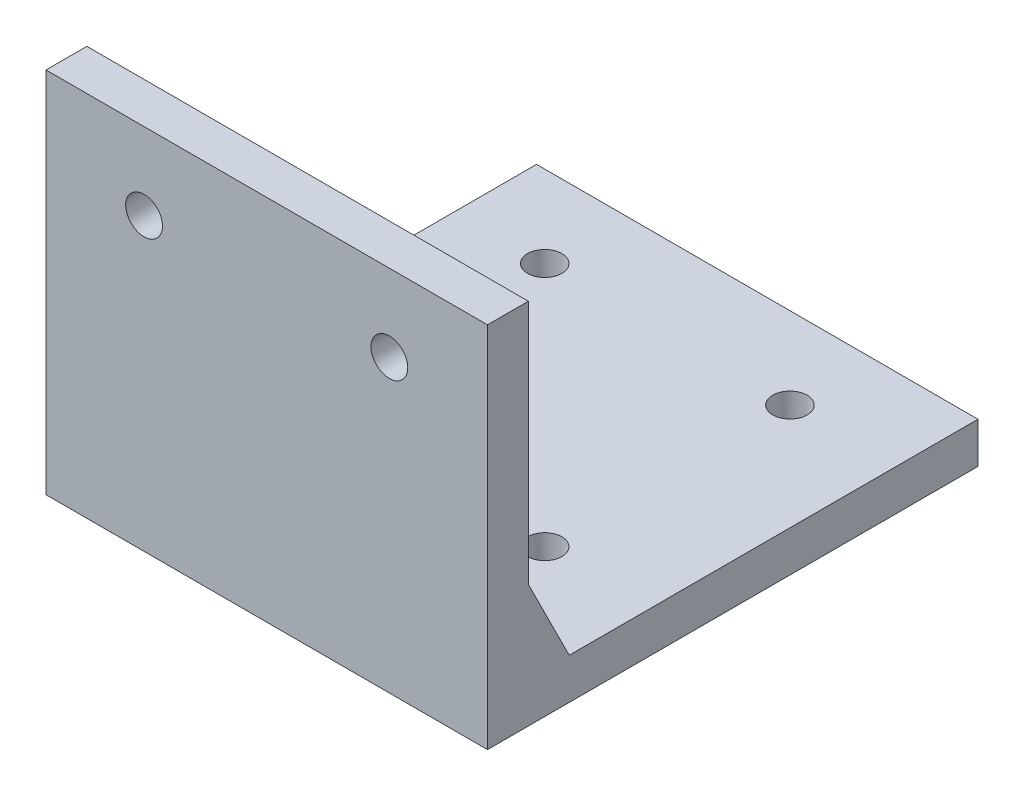
ISO-10303-21;
HEADER;
FILE_DESCRIPTION(('STEP AP214'),'2;1');
FILE_NAME('part.step','',(''),(''),'','','');
FILE_SCHEMA(('AUTOMOTIVE_DESIGN { 1 0 10303 214 1 1 1 1 }'));
ENDSEC;
DATA;
#1=APPLICATION_CONTEXT('core data for automotive mechanical design processes');
#2=APPLICATION_PROTOCOL_DEFINITION('international standard','automotive_design',2000,#1);
#3=PRODUCT_CONTEXT('',#1,'mechanical');
#4=PRODUCT('Part','Part','',(#3));
#5=PRODUCT_RELATED_PRODUCT_CATEGORY('part','',(#4));
#6=PRODUCT_DEFINITION_FORMATION('','',#4);
#7=PRODUCT_DEFINITION_CONTEXT('part definition',#1,'design');
#8=PRODUCT_DEFINITION('design','',#6,#7);
#9=PRODUCT_DEFINITION_SHAPE('','',#8);
#10=(LENGTH_UNIT() NAMED_UNIT(*) SI_UNIT(.MILLI.,.METRE.));
#11=(NAMED_UNIT(*) PLANE_ANGLE_UNIT() SI_UNIT($,.RADIAN.));
#12=(NAMED_UNIT(*) SI_UNIT($,.STERADIAN.) SOLID_ANGLE_UNIT());
#13=UNCERTAINTY_MEASURE_WITH_UNIT(LENGTH_MEASURE(1.E-05),#10,'distance_accuracy_value','');
#14=(GEOMETRIC_REPRESENTATION_CONTEXT(3) GLOBAL_UNCERTAINTY_ASSIGNED_CONTEXT((#13)) GLOBAL_UNIT_ASSIGNED_CONTEXT((#10,
#11,#12)) REPRESENTATION_CONTEXT('',''));
#15=CARTESIAN_POINT('',(0.,0.,0.));
#16=DIRECTION('',(0.,0.,1.));
#17=DIRECTION('',(1.,0.,0.));
#18=AXIS2_PLACEMENT_3D('',#15,#16,#17);
#19=CARTESIAN_POINT('',(54.,-17.9206342242443,1.15557027180788));
#20=DIRECTION('',(0.,0.,1.));
#21=DIRECTION('',(1.,0.,0.));
#22=AXIS2_PLACEMENT_3D('',#19,#20,#21);
#23=PLANE('',#22);
#24=CARTESIAN_POINT('',(42.,17.6532462868641,1.15557027180788));
#25=DIRECTION('',(0.,0.,1.));
#26=DIRECTION('',(1.,0.,0.));
#27=AXIS2_PLACEMENT_3D('',#24,#25,#26);
#28=CIRCLE('',#27,2.25);
#29=CARTESIAN_POINT('',(44.25,17.6532462868641,1.15557027180788));
#30=VERTEX_POINT('',#29);
#31=EDGE_CURVE('E146',#30,#30,#28,.T.);
#32=ORIENTED_EDGE('',*,*,#31,.F.);
#33=EDGE_LOOP('',(#32));
#34=FACE_BOUND('',#33,.T.);
#35=CARTESIAN_POINT('',(12.,17.6532462868641,1.15557027180788));
#36=DIRECTION('',(0.,0.,1.));
#37=DIRECTION('',(1.,0.,0.));
#38=AXIS2_PLACEMENT_3D('',#35,#36,#37);
#39=CIRCLE('',#38,2.25);
#40=CARTESIAN_POINT('',(14.25,17.6532462868641,1.15557027180788));
#41=VERTEX_POINT('',#40);
#42=EDGE_CURVE('E141',#41,#41,#39,.T.);
#43=ORIENTED_EDGE('',*,*,#42,.F.);
#44=EDGE_LOOP('',(#43));
#45=FACE_BOUND('',#44,.T.);
#46=DIRECTION('',(0.,1.,0.));
#47=VECTOR('',#46,1.);
#48=CARTESIAN_POINT('',(0.,-17.9206342242443,1.15557027180788));
#49=LINE('',#48,#47);
#50=CARTESIAN_POINT('',(0.,-17.9206342242443,1.15557027180788));
#51=VERTEX_POINT('',#50);
#52=CARTESIAN_POINT('',(0.,27.0793657757557,1.15557027180788));
#53=VERTEX_POINT('',#52);
#54=EDGE_CURVE('E122',#51,#53,#49,.T.);
#55=ORIENTED_EDGE('',*,*,#54,.F.);
#56=DIRECTION('',(-1.,0.,0.));
#57=VECTOR('',#56,1.);
#58=CARTESIAN_POINT('',(54.,-17.9206342242443,1.15557027180788));
#59=LINE('',#58,#57);
#60=CARTESIAN_POINT('',(54.,-17.9206342242443,1.15557027180788));
#61=VERTEX_POINT('',#60);
#62=EDGE_CURVE('E11',#61,#51,#59,.T.);
#63=ORIENTED_EDGE('',*,*,#62,.F.);
#64=DIRECTION('',(0.,1.,0.));
#65=VECTOR('',#64,1.);
#66=CARTESIAN_POINT('',(54.,-17.9206342242443,1.15557027180788));
#67=LINE('',#66,#65);
#68=CARTESIAN_POINT('',(54.,27.0793657757557,1.15557027180788));
#69=VERTEX_POINT('',#68);
#70=EDGE_CURVE('E131',#61,#69,#67,.T.);
#71=ORIENTED_EDGE('',*,*,#70,.T.);
#72=DIRECTION('',(-1.,0.,0.));
#73=VECTOR('',#72,1.);
#74=CARTESIAN_POINT('',(54.,27.0793657757557,1.15557027180788));
#75=LINE('',#74,#73);
#76=EDGE_CURVE('E135',#69,#53,#75,.T.);
#77=ORIENTED_EDGE('',*,*,#76,.T.);
#78=EDGE_LOOP('',(#55,#63,#71,#77));
#79=FACE_BOUND('',#78,.T.);
#80=ADVANCED_FACE('F40',(#34,#45,#79),#23,.T.);
#81=CARTESIAN_POINT('',(54.,-17.9206342242443,1.15557027180788));
#82=DIRECTION('',(0.,1.,0.));
#83=DIRECTION('',(0.,0.,1.));
#84=AXIS2_PLACEMENT_3D('',#81,#82,#83);
#85=PLANE('',#84);
#86=CARTESIAN_POINT('',(41.,-17.9206342242443,-48.8444297281921));
#87=DIRECTION('',(0.,1.,0.));
#88=DIRECTION('',(0.,0.,1.));
#89=AXIS2_PLACEMENT_3D('',#86,#87,#88);
#90=CIRCLE('',#89,2.1);
#91=CARTESIAN_POINT('',(41.,-17.9206342242443,-46.7444297281921));
#92=VERTEX_POINT('',#91);
#93=EDGE_CURVE('E142',#92,#92,#90,.T.);
#94=ORIENTED_EDGE('',*,*,#93,.T.);
#95=EDGE_LOOP('',(#94));
#96=FACE_BOUND('',#95,.T.);
#97=CARTESIAN_POINT('',(11.,-17.9206342242443,-18.8444297281921));
#98=DIRECTION('',(0.,1.,0.));
#99=DIRECTION('',(0.,0.,1.));
#100=AXIS2_PLACEMENT_3D('',#97,#98,#99);
#101=CIRCLE('',#100,2.1);
#102=CARTESIAN_POINT('',(11.,-17.9206342242443,-16.7444297281921));
#103=VERTEX_POINT('',#102);
#104=EDGE_CURVE('E156',#103,#103,#101,.T.);
#105=ORIENTED_EDGE('',*,*,#104,.T.);
#106=EDGE_LOOP('',(#105));
#107=FACE_BOUND('',#106,.T.);
#108=CARTESIAN_POINT('',(41.,-17.9206342242443,-18.8444297281921));
#109=DIRECTION('',(0.,1.,0.));
#110=DIRECTION('',(0.,0.,1.));
#111=AXIS2_PLACEMENT_3D('',#108,#109,#110);
#112=CIRCLE('',#111,2.1);
#113=CARTESIAN_POINT('',(41.,-17.9206342242443,-16.7444297281921));
#114=VERTEX_POINT('',#113);
#115=EDGE_CURVE('E153',#114,#114,#112,.T.);
#116=ORIENTED_EDGE('',*,*,#115,.T.);
#117=EDGE_LOOP('',(#116));
#118=FACE_BOUND('',#117,.T.);
#119=CARTESIAN_POINT('',(11.,-17.9206342242443,-48.8444297281921));
#120=DIRECTION('',(0.,1.,0.));
#121=DIRECTION('',(0.,0.,1.));
#122=AXIS2_PLACEMENT_3D('',#119,#120,#121);
#123=CIRCLE('',#122,2.1);
#124=CARTESIAN_POINT('',(11.,-17.9206342242443,-46.7444297281921));
#125=VERTEX_POINT('',#124);
#126=EDGE_CURVE('E150',#125,#125,#123,.T.);
#127=ORIENTED_EDGE('',*,*,#126,.T.);
#128=EDGE_LOOP('',(#127));
#129=FACE_BOUND('',#128,.T.);
#130=DIRECTION('',(0.,0.,-1.));
#131=VECTOR('',#130,1.);
#132=CARTESIAN_POINT('',(0.,-17.9206342242443,1.15557027180788));
#133=LINE('',#132,#131);
#134=CARTESIAN_POINT('',(0.,-17.9206342242443,-58.8444297281921));
#135=VERTEX_POINT('',#134);
#136=EDGE_CURVE('E126',#51,#135,#133,.T.);
#137=ORIENTED_EDGE('',*,*,#136,.T.);
#138=DIRECTION('',(-1.,0.,0.));
#139=VECTOR('',#138,1.);
#140=CARTESIAN_POINT('',(54.,-17.9206342242443,-58.8444297281921));
#141=LINE('',#140,#139);
#142=CARTESIAN_POINT('',(54.,-17.9206342242443,-58.8444297281921));
#143=VERTEX_POINT('',#142);
#144=EDGE_CURVE('E48',#143,#135,#141,.T.);
#145=ORIENTED_EDGE('',*,*,#144,.F.);
#146=DIRECTION('',(0.,0.,-1.));
#147=VECTOR('',#146,1.);
#148=CARTESIAN_POINT('',(54.,-17.9206342242443,1.15557027180788));
#149=LINE('',#148,#147);
#150=EDGE_CURVE('E137',#61,#143,#149,.T.);
#151=ORIENTED_EDGE('',*,*,#150,.F.);
#152=ORIENTED_EDGE('',*,*,#62,.T.);
#153=EDGE_LOOP('',(#137,#145,#151,#152));
#154=FACE_BOUND('',#153,.T.);
#155=ADVANCED_FACE('F192',(#96,#107,#118,#129,#154),#85,.F.);
#156=CARTESIAN_POINT('',(54.,-17.9206342242443,-58.8444297281921));
#157=DIRECTION('',(0.,0.,1.));
#158=DIRECTION('',(1.,0.,0.));
#159=AXIS2_PLACEMENT_3D('',#156,#157,#158);
#160=PLANE('',#159);
#161=DIRECTION('',(0.,1.,0.));
#162=VECTOR('',#161,1.);
#163=CARTESIAN_POINT('',(0.,-17.9206342242443,-58.8444297281921));
#164=LINE('',#163,#162);
#165=CARTESIAN_POINT('',(0.,-12.9206342242443,-58.8444297281921));
#166=VERTEX_POINT('',#165);
#167=EDGE_CURVE('E123',#135,#166,#164,.T.);
#168=ORIENTED_EDGE('',*,*,#167,.T.);
#169=DIRECTION('',(1.,0.,0.));
#170=VECTOR('',#169,1.);
#171=CARTESIAN_POINT('',(0.,-12.9206342242443,-58.8444297281921));
#172=LINE('',#171,#170);
#173=CARTESIAN_POINT('',(54.,-12.9206342242443,-58.8444297281921));
#174=VERTEX_POINT('',#173);
#175=EDGE_CURVE('E117',#166,#174,#172,.T.);
#176=ORIENTED_EDGE('',*,*,#175,.T.);
#177=DIRECTION('',(0.,1.,0.));
#178=VECTOR('',#177,1.);
#179=CARTESIAN_POINT('',(54.,-17.9206342242443,-58.8444297281921));
#180=LINE('',#179,#178);
#181=EDGE_CURVE('E183',#143,#174,#180,.T.);
#182=ORIENTED_EDGE('',*,*,#181,.F.);
#183=ORIENTED_EDGE('',*,*,#144,.T.);
#184=EDGE_LOOP('',(#168,#176,#182,#183));
#185=FACE_BOUND('',#184,.T.);
#186=ADVANCED_FACE('F195',(#185),#160,.F.);
#187=CARTESIAN_POINT('',(54.,27.0793657757557,1.15557027180788));
#188=DIRECTION('',(0.,1.,0.));
#189=DIRECTION('',(0.,0.,1.));
#190=AXIS2_PLACEMENT_3D('',#187,#188,#189);
#191=PLANE('',#190);
#192=DIRECTION('',(1.,0.,0.));
#193=VECTOR('',#192,1.);
#194=CARTESIAN_POINT('',(0.,27.0793657757557,-3.84442972819211));
#195=LINE('',#194,#193);
#196=CARTESIAN_POINT('',(0.,27.0793657757557,-3.84442972819211));
#197=VERTEX_POINT('',#196);
#198=CARTESIAN_POINT('',(54.,27.0793657757557,-3.84442972819211));
#199=VERTEX_POINT('',#198);
#200=EDGE_CURVE('E99',#197,#199,#195,.T.);
#201=ORIENTED_EDGE('',*,*,#200,.F.);
#202=DIRECTION('',(0.,0.,-1.));
#203=VECTOR('',#202,1.);
#204=CARTESIAN_POINT('',(0.,27.0793657757557,1.15557027180788));
#205=LINE('',#204,#203);
#206=EDGE_CURVE('E113',#53,#197,#205,.T.);
#207=ORIENTED_EDGE('',*,*,#206,.F.);
#208=ORIENTED_EDGE('',*,*,#76,.F.);
#209=DIRECTION('',(0.,0.,-1.));
#210=VECTOR('',#209,1.);
#211=CARTESIAN_POINT('',(54.,27.0793657757557,1.15557027180788));
#212=LINE('',#211,#210);
#213=EDGE_CURVE('E116',#69,#199,#212,.T.);
#214=ORIENTED_EDGE('',*,*,#213,.T.);
#215=EDGE_LOOP('',(#201,#207,#208,#214));
#216=FACE_BOUND('',#215,.T.);
#217=ADVANCED_FACE('F112',(#216),#191,.T.);
#218=CARTESIAN_POINT('',(54.,0.,0.));
#219=DIRECTION('',(-1.,0.,0.));
#220=DIRECTION('',(0.,0.,1.));
#221=AXIS2_PLACEMENT_3D('',#218,#219,#220);
#222=PLANE('',#221);
#223=DIRECTION('',(0.,0.,-1.));
#224=VECTOR('',#223,1.);
#225=CARTESIAN_POINT('',(54.,-12.9206342242443,-3.84442972819212));
#226=LINE('',#225,#224);
#227=CARTESIAN_POINT('',(54.,-12.9206342242443,-8.84442972819212));
#228=VERTEX_POINT('',#227);
#229=EDGE_CURVE('E107',#228,#174,#226,.T.);
#230=ORIENTED_EDGE('',*,*,#229,.F.);
#231=DIRECTION('',(0.,0.894427190999916,0.447213595499958));
#232=VECTOR('',#231,1.);
#233=CARTESIAN_POINT('',(54.,-2.92063422424431,-3.84442972819211));
#234=LINE('',#233,#232);
#235=CARTESIAN_POINT('',(54.,-2.92063422424431,-3.84442972819212));
#236=VERTEX_POINT('',#235);
#237=EDGE_CURVE('E199',#228,#236,#234,.T.);
#238=ORIENTED_EDGE('',*,*,#237,.T.);
#239=DIRECTION('',(0.,-1.,0.));
#240=VECTOR('',#239,1.);
#241=CARTESIAN_POINT('',(54.,27.0793657757557,-3.84442972819211));
#242=LINE('',#241,#240);
#243=EDGE_CURVE('E173',#199,#236,#242,.T.);
#244=ORIENTED_EDGE('',*,*,#243,.F.);
#245=ORIENTED_EDGE('',*,*,#213,.F.);
#246=ORIENTED_EDGE('',*,*,#70,.F.);
#247=ORIENTED_EDGE('',*,*,#150,.T.);
#248=ORIENTED_EDGE('',*,*,#181,.T.);
#249=EDGE_LOOP('',(#230,#238,#244,#245,#246,#247,#248));
#250=FACE_BOUND('',#249,.T.);
#251=ADVANCED_FACE('F189',(#250),#222,.F.);
#252=CARTESIAN_POINT('',(0.,0.,0.));
#253=DIRECTION('',(-1.,0.,0.));
#254=DIRECTION('',(0.,0.,1.));
#255=AXIS2_PLACEMENT_3D('',#252,#253,#254);
#256=PLANE('',#255);
#257=DIRECTION('',(0.,0.894427190999916,0.447213595499958));
#258=VECTOR('',#257,1.);
#259=CARTESIAN_POINT('',(0.,-2.92063422424431,-3.84442972819211));
#260=LINE('',#259,#258);
#261=CARTESIAN_POINT('',(0.,-12.9206342242443,-8.84442972819212));
#262=VERTEX_POINT('',#261);
#263=CARTESIAN_POINT('',(0.,-2.92063422424431,-3.84442972819212));
#264=VERTEX_POINT('',#263);
#265=EDGE_CURVE('E202',#262,#264,#260,.T.);
#266=ORIENTED_EDGE('',*,*,#265,.F.);
#267=DIRECTION('',(0.,0.,-1.));
#268=VECTOR('',#267,1.);
#269=CARTESIAN_POINT('',(0.,-12.9206342242443,-3.84442972819212));
#270=LINE('',#269,#268);
#271=EDGE_CURVE('E56',#262,#166,#270,.T.);
#272=ORIENTED_EDGE('',*,*,#271,.T.);
#273=ORIENTED_EDGE('',*,*,#167,.F.);
#274=ORIENTED_EDGE('',*,*,#136,.F.);
#275=ORIENTED_EDGE('',*,*,#54,.T.);
#276=ORIENTED_EDGE('',*,*,#206,.T.);
#277=DIRECTION('',(0.,-1.,0.));
#278=VECTOR('',#277,1.);
#279=CARTESIAN_POINT('',(0.,27.0793657757557,-3.84442972819211));
#280=LINE('',#279,#278);
#281=EDGE_CURVE('E96',#197,#264,#280,.T.);
#282=ORIENTED_EDGE('',*,*,#281,.T.);
#283=EDGE_LOOP('',(#266,#272,#273,#274,#275,#276,#282));
#284=FACE_BOUND('',#283,.T.);
#285=ADVANCED_FACE('F119',(#284),#256,.T.);
#286=CARTESIAN_POINT('',(0.,-12.9206342242443,-3.84442972819212));
#287=DIRECTION('',(0.,-1.,0.));
#288=DIRECTION('',(0.,0.,-1.));
#289=AXIS2_PLACEMENT_3D('',#286,#287,#288);
#290=PLANE('',#289);
#291=CARTESIAN_POINT('',(41.,-12.9206342242443,-48.8444297281921));
#292=DIRECTION('',(0.,-1.,0.));
#293=DIRECTION('',(0.,0.,-1.));
#294=AXIS2_PLACEMENT_3D('',#291,#292,#293);
#295=CIRCLE('',#294,2.1);
#296=CARTESIAN_POINT('',(41.,-12.9206342242443,-50.9444297281921));
#297=VERTEX_POINT('',#296);
#298=EDGE_CURVE('E43',#297,#297,#295,.T.);
#299=ORIENTED_EDGE('',*,*,#298,.T.);
#300=EDGE_LOOP('',(#299));
#301=FACE_BOUND('',#300,.T.);
#302=CARTESIAN_POINT('',(11.,-12.9206342242443,-18.8444297281921));
#303=DIRECTION('',(0.,-1.,0.));
#304=DIRECTION('',(0.,0.,-1.));
#305=AXIS2_PLACEMENT_3D('',#302,#303,#304);
#306=CIRCLE('',#305,2.1);
#307=CARTESIAN_POINT('',(11.,-12.9206342242443,-20.9444297281921));
#308=VERTEX_POINT('',#307);
#309=EDGE_CURVE('E154',#308,#308,#306,.T.);
#310=ORIENTED_EDGE('',*,*,#309,.T.);
#311=EDGE_LOOP('',(#310));
#312=FACE_BOUND('',#311,.T.);
#313=CARTESIAN_POINT('',(41.,-12.9206342242443,-18.8444297281921));
#314=DIRECTION('',(0.,-1.,0.));
#315=DIRECTION('',(0.,0.,-1.));
#316=AXIS2_PLACEMENT_3D('',#313,#314,#315);
#317=CIRCLE('',#316,2.1);
#318=CARTESIAN_POINT('',(41.,-12.9206342242443,-20.9444297281921));
#319=VERTEX_POINT('',#318);
#320=EDGE_CURVE('E151',#319,#319,#317,.T.);
#321=ORIENTED_EDGE('',*,*,#320,.T.);
#322=EDGE_LOOP('',(#321));
#323=FACE_BOUND('',#322,.T.);
#324=CARTESIAN_POINT('',(11.,-12.9206342242443,-48.8444297281921));
#325=DIRECTION('',(0.,-1.,0.));
#326=DIRECTION('',(0.,0.,-1.));
#327=AXIS2_PLACEMENT_3D('',#324,#325,#326);
#328=CIRCLE('',#327,2.1);
#329=CARTESIAN_POINT('',(11.,-12.9206342242443,-50.9444297281921));
#330=VERTEX_POINT('',#329);
#331=EDGE_CURVE('E147',#330,#330,#328,.T.);
#332=ORIENTED_EDGE('',*,*,#331,.T.);
#333=EDGE_LOOP('',(#332));
#334=FACE_BOUND('',#333,.T.);
#335=ORIENTED_EDGE('',*,*,#271,.F.);
#336=DIRECTION('',(1.,0.,0.));
#337=VECTOR('',#336,1.);
#338=CARTESIAN_POINT('',(0.,-12.9206342242443,-8.84442972819212));
#339=LINE('',#338,#337);
#340=EDGE_CURVE('E60',#262,#228,#339,.T.);
#341=ORIENTED_EDGE('',*,*,#340,.T.);
#342=ORIENTED_EDGE('',*,*,#229,.T.);
#343=ORIENTED_EDGE('',*,*,#175,.F.);
#344=EDGE_LOOP('',(#335,#341,#342,#343));
#345=FACE_BOUND('',#344,.T.);
#346=ADVANCED_FACE('F196',(#301,#312,#323,#334,#345),#290,.F.);
#347=CARTESIAN_POINT('',(0.,27.0793657757557,-3.84442972819211));
#348=DIRECTION('',(0.,0.,1.));
#349=DIRECTION('',(0.,-1.,0.));
#350=AXIS2_PLACEMENT_3D('',#347,#348,#349);
#351=PLANE('',#350);
#352=CARTESIAN_POINT('',(42.,17.6532462868641,-3.84442972819211));
#353=DIRECTION('',(0.,0.,1.));
#354=DIRECTION('',(0.,-1.,0.));
#355=AXIS2_PLACEMENT_3D('',#352,#353,#354);
#356=CIRCLE('',#355,2.25);
#357=CARTESIAN_POINT('',(42.,15.4032462868641,-3.84442972819211));
#358=VERTEX_POINT('',#357);
#359=EDGE_CURVE('E143',#358,#358,#356,.T.);
#360=ORIENTED_EDGE('',*,*,#359,.T.);
#361=EDGE_LOOP('',(#360));
#362=FACE_BOUND('',#361,.T.);
#363=CARTESIAN_POINT('',(12.,17.6532462868641,-3.84442972819211));
#364=DIRECTION('',(0.,0.,1.));
#365=DIRECTION('',(0.,-1.,0.));
#366=AXIS2_PLACEMENT_3D('',#363,#364,#365);
#367=CIRCLE('',#366,2.25);
#368=CARTESIAN_POINT('',(12.,15.4032462868641,-3.84442972819211));
#369=VERTEX_POINT('',#368);
#370=EDGE_CURVE('E138',#369,#369,#367,.T.);
#371=ORIENTED_EDGE('',*,*,#370,.T.);
#372=EDGE_LOOP('',(#371));
#373=FACE_BOUND('',#372,.T.);
#374=ORIENTED_EDGE('',*,*,#243,.T.);
#375=DIRECTION('',(1.,0.,0.));
#376=VECTOR('',#375,1.);
#377=CARTESIAN_POINT('',(0.,-2.92063422424431,-3.84442972819211));
#378=LINE('',#377,#376);
#379=EDGE_CURVE('E102',#264,#236,#378,.T.);
#380=ORIENTED_EDGE('',*,*,#379,.F.);
#381=ORIENTED_EDGE('',*,*,#281,.F.);
#382=ORIENTED_EDGE('',*,*,#200,.T.);
#383=EDGE_LOOP('',(#374,#380,#381,#382));
#384=FACE_BOUND('',#383,.T.);
#385=ADVANCED_FACE('F98',(#362,#373,#384),#351,.F.);
#386=CARTESIAN_POINT('',(12.,17.6532462868641,23.1555702718079));
#387=DIRECTION('',(0.,0.,-1.));
#388=DIRECTION('',(0.,1.,0.));
#389=AXIS2_PLACEMENT_3D('',#386,#387,#388);
#390=CYLINDRICAL_SURFACE('',#389,2.25);
#391=ORIENTED_EDGE('',*,*,#42,.T.);
#392=EDGE_LOOP('',(#391));
#393=FACE_BOUND('',#392,.T.);
#394=ORIENTED_EDGE('',*,*,#370,.F.);
#395=EDGE_LOOP('',(#394));
#396=FACE_BOUND('',#395,.T.);
#397=ADVANCED_FACE('F218',(#393,#396),#390,.F.);
#398=CARTESIAN_POINT('',(42.,17.6532462868641,23.1555702718079));
#399=DIRECTION('',(0.,0.,-1.));
#400=DIRECTION('',(0.,1.,0.));
#401=AXIS2_PLACEMENT_3D('',#398,#399,#400);
#402=CYLINDRICAL_SURFACE('',#401,2.25);
#403=ORIENTED_EDGE('',*,*,#31,.T.);
#404=EDGE_LOOP('',(#403));
#405=FACE_BOUND('',#404,.T.);
#406=ORIENTED_EDGE('',*,*,#359,.F.);
#407=EDGE_LOOP('',(#406));
#408=FACE_BOUND('',#407,.T.);
#409=ADVANCED_FACE('F221',(#405,#408),#402,.F.);
#410=CARTESIAN_POINT('',(11.,-39.9206342242443,-48.8444297281921));
#411=DIRECTION('',(0.,1.,0.));
#412=DIRECTION('',(0.,0.,1.));
#413=AXIS2_PLACEMENT_3D('',#410,#411,#412);
#414=CYLINDRICAL_SURFACE('',#413,2.1);
#415=ORIENTED_EDGE('',*,*,#331,.F.);
#416=EDGE_LOOP('',(#415));
#417=FACE_BOUND('',#416,.T.);
#418=ORIENTED_EDGE('',*,*,#126,.F.);
#419=EDGE_LOOP('',(#418));
#420=FACE_BOUND('',#419,.T.);
#421=ADVANCED_FACE('F298',(#417,#420),#414,.F.);
#422=CARTESIAN_POINT('',(41.,-39.9206342242443,-18.8444297281921));
#423=DIRECTION('',(0.,1.,0.));
#424=DIRECTION('',(0.,0.,1.));
#425=AXIS2_PLACEMENT_3D('',#422,#423,#424);
#426=CYLINDRICAL_SURFACE('',#425,2.1);
#427=ORIENTED_EDGE('',*,*,#320,.F.);
#428=EDGE_LOOP('',(#427));
#429=FACE_BOUND('',#428,.T.);
#430=ORIENTED_EDGE('',*,*,#115,.F.);
#431=EDGE_LOOP('',(#430));
#432=FACE_BOUND('',#431,.T.);
#433=ADVANCED_FACE('F290',(#429,#432),#426,.F.);
#434=CARTESIAN_POINT('',(11.,-39.9206342242443,-18.8444297281921));
#435=DIRECTION('',(0.,1.,0.));
#436=DIRECTION('',(0.,0.,1.));
#437=AXIS2_PLACEMENT_3D('',#434,#435,#436);
#438=CYLINDRICAL_SURFACE('',#437,2.1);
#439=ORIENTED_EDGE('',*,*,#309,.F.);
#440=EDGE_LOOP('',(#439));
#441=FACE_BOUND('',#440,.T.);
#442=ORIENTED_EDGE('',*,*,#104,.F.);
#443=EDGE_LOOP('',(#442));
#444=FACE_BOUND('',#443,.T.);
#445=ADVANCED_FACE('F282',(#441,#444),#438,.F.);
#446=CARTESIAN_POINT('',(41.,-39.9206342242443,-48.8444297281921));
#447=DIRECTION('',(0.,1.,0.));
#448=DIRECTION('',(0.,0.,1.));
#449=AXIS2_PLACEMENT_3D('',#446,#447,#448);
#450=CYLINDRICAL_SURFACE('',#449,2.1);
#451=ORIENTED_EDGE('',*,*,#298,.F.);
#452=EDGE_LOOP('',(#451));
#453=FACE_BOUND('',#452,.T.);
#454=ORIENTED_EDGE('',*,*,#93,.F.);
#455=EDGE_LOOP('',(#454));
#456=FACE_BOUND('',#455,.T.);
#457=ADVANCED_FACE('F273',(#453,#456),#450,.F.);
#458=CARTESIAN_POINT('',(0.,-2.92063422424431,-3.84442972819211));
#459=DIRECTION('',(0.,0.447213595499958,-0.894427190999916));
#460=DIRECTION('',(0.,0.894427190999916,0.447213595499958));
#461=AXIS2_PLACEMENT_3D('',#458,#459,#460);
#462=PLANE('',#461);
#463=ORIENTED_EDGE('',*,*,#237,.F.);
#464=ORIENTED_EDGE('',*,*,#340,.F.);
#465=ORIENTED_EDGE('',*,*,#265,.T.);
#466=ORIENTED_EDGE('',*,*,#379,.T.);
#467=EDGE_LOOP('',(#463,#464,#465,#466));
#468=FACE_BOUND('',#467,.T.);
#469=ADVANCED_FACE('F201',(#468),#462,.T.);
#470=CLOSED_SHELL('',(#80,#155,#186,#217,#251,#285,#346,#385,#397,#409,#421,#433,#445,#457,#469));
#471=MANIFOLD_SOLID_BREP('B2',#470);
#472=ADVANCED_BREP_SHAPE_REPRESENTATION('',(#18,#471),#14);
#473=SHAPE_DEFINITION_REPRESENTATION(#9,#472);
ENDSEC;
END-ISO-10303-21;
